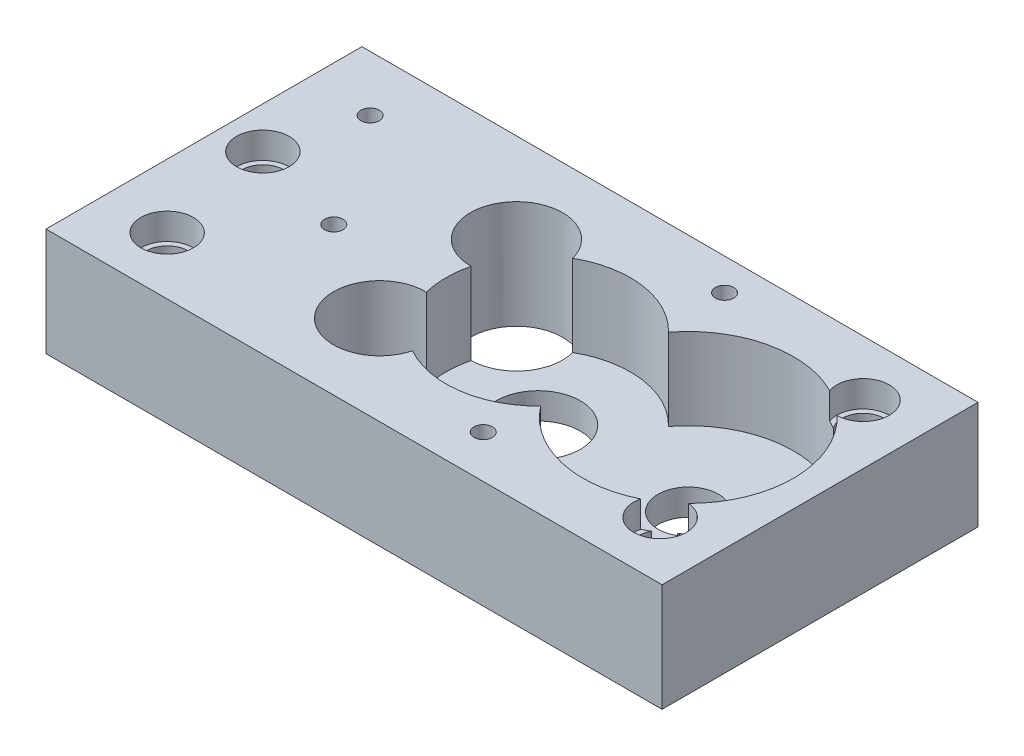
ISO-10303-21;
HEADER;
FILE_DESCRIPTION(('STEP AP214'),'2;1');
FILE_NAME('part.step','',(''),(''),'','','');
FILE_SCHEMA(('AUTOMOTIVE_DESIGN { 1 0 10303 214 1 1 1 1 }'));
ENDSEC;
DATA;
#1=APPLICATION_CONTEXT('core data for automotive mechanical design processes');
#2=APPLICATION_PROTOCOL_DEFINITION('international standard','automotive_design',2000,#1);
#3=PRODUCT_CONTEXT('',#1,'mechanical');
#4=PRODUCT('Part','Part','',(#3));
#5=PRODUCT_RELATED_PRODUCT_CATEGORY('part','',(#4));
#6=PRODUCT_DEFINITION_FORMATION('','',#4);
#7=PRODUCT_DEFINITION_CONTEXT('part definition',#1,'design');
#8=PRODUCT_DEFINITION('design','',#6,#7);
#9=PRODUCT_DEFINITION_SHAPE('','',#8);
#10=(LENGTH_UNIT() NAMED_UNIT(*) SI_UNIT(.MILLI.,.METRE.));
#11=(NAMED_UNIT(*) PLANE_ANGLE_UNIT() SI_UNIT($,.RADIAN.));
#12=(NAMED_UNIT(*) SI_UNIT($,.STERADIAN.) SOLID_ANGLE_UNIT());
#13=UNCERTAINTY_MEASURE_WITH_UNIT(LENGTH_MEASURE(1.E-05),#10,'distance_accuracy_value','');
#14=(GEOMETRIC_REPRESENTATION_CONTEXT(3) GLOBAL_UNCERTAINTY_ASSIGNED_CONTEXT((#13)) GLOBAL_UNIT_ASSIGNED_CONTEXT((#10,
#11,#12)) REPRESENTATION_CONTEXT('',''));
#15=CARTESIAN_POINT('',(0.,0.,0.));
#16=DIRECTION('',(0.,0.,1.));
#17=DIRECTION('',(1.,0.,0.));
#18=AXIS2_PLACEMENT_3D('',#15,#16,#17);
#19=CARTESIAN_POINT('',(18.3957400587213,4.1,6.));
#20=DIRECTION('',(0.,-1.,0.));
#21=DIRECTION('',(0.,0.,-1.));
#22=AXIS2_PLACEMENT_3D('',#19,#20,#21);
#23=CYLINDRICAL_SURFACE('',#22,4.);
#24=DIRECTION('',(0.,1.,0.));
#25=VECTOR('',#24,1.);
#26=CARTESIAN_POINT('',(20.8787211712977,2.05,2.8639507665554));
#27=LINE('',#26,#25);
#28=CARTESIAN_POINT('',(20.8787211712977,1.,2.8639507665554));
#29=VERTEX_POINT('',#28);
#30=CARTESIAN_POINT('',(20.8787211712977,3.1,2.8639507665554));
#31=VERTEX_POINT('',#30);
#32=EDGE_CURVE('E202',#29,#31,#27,.T.);
#33=ORIENTED_EDGE('',*,*,#32,.F.);
#34=CARTESIAN_POINT('',(18.3957400587213,1.,6.));
#35=DIRECTION('',(0.,1.,0.));
#36=DIRECTION('',(0.,0.,1.));
#37=AXIS2_PLACEMENT_3D('',#34,#35,#36);
#38=CIRCLE('',#37,4.);
#39=CARTESIAN_POINT('',(21.0082696303386,1.,9.02897494829937));
#40=VERTEX_POINT('',#39);
#41=EDGE_CURVE('E443',#40,#29,#38,.T.);
#42=ORIENTED_EDGE('',*,*,#41,.F.);
#43=DIRECTION('',(0.,1.,0.));
#44=VECTOR('',#43,1.);
#45=CARTESIAN_POINT('',(21.0082696303386,2.05,9.02897494829937));
#46=LINE('',#45,#44);
#47=CARTESIAN_POINT('',(21.0082696303386,3.1,9.02897494829937));
#48=VERTEX_POINT('',#47);
#49=EDGE_CURVE('E736',#48,#40,#46,.F.);
#50=ORIENTED_EDGE('',*,*,#49,.F.);
#51=CARTESIAN_POINT('',(18.3957400587213,3.1,6.));
#52=DIRECTION('',(0.,1.,0.));
#53=DIRECTION('',(0.,0.,1.));
#54=AXIS2_PLACEMENT_3D('',#51,#52,#53);
#55=CIRCLE('',#54,4.);
#56=CARTESIAN_POINT('',(21.2311790088857,3.1,8.82139787337597));
#57=VERTEX_POINT('',#56);
#58=EDGE_CURVE('E535',#48,#57,#55,.T.);
#59=ORIENTED_EDGE('',*,*,#58,.T.);
#60=DIRECTION('',(0.,1.,0.));
#61=VECTOR('',#60,1.);
#62=CARTESIAN_POINT('',(21.2311790088857,3.6,8.82139787337597));
#63=LINE('',#62,#61);
#64=CARTESIAN_POINT('',(21.2311790088857,4.1,8.82139787337597));
#65=VERTEX_POINT('',#64);
#66=EDGE_CURVE('E333',#65,#57,#63,.F.);
#67=ORIENTED_EDGE('',*,*,#66,.F.);
#68=CARTESIAN_POINT('',(18.3957400587213,4.1,6.));
#69=DIRECTION('',(0.,1.,0.));
#70=DIRECTION('',(0.,0.,1.));
#71=AXIS2_PLACEMENT_3D('',#68,#69,#70);
#72=CIRCLE('',#71,4.);
#73=CARTESIAN_POINT('',(21.1599528823134,4.1,3.10878443109328));
#74=VERTEX_POINT('',#73);
#75=EDGE_CURVE('E437',#65,#74,#72,.T.);
#76=ORIENTED_EDGE('',*,*,#75,.T.);
#77=DIRECTION('',(0.,1.,0.));
#78=VECTOR('',#77,1.);
#79=CARTESIAN_POINT('',(21.1599528823134,3.6,3.10878443109328));
#80=LINE('',#79,#78);
#81=CARTESIAN_POINT('',(21.1599528823134,3.1,3.10878443109328));
#82=VERTEX_POINT('',#81);
#83=EDGE_CURVE('E310',#82,#74,#80,.T.);
#84=ORIENTED_EDGE('',*,*,#83,.F.);
#85=CARTESIAN_POINT('',(18.3957400587213,3.1,6.));
#86=DIRECTION('',(0.,1.,0.));
#87=DIRECTION('',(0.,0.,1.));
#88=AXIS2_PLACEMENT_3D('',#85,#86,#87);
#89=CIRCLE('',#88,4.);
#90=EDGE_CURVE('E327',#82,#31,#89,.T.);
#91=ORIENTED_EDGE('',*,*,#90,.T.);
#92=EDGE_LOOP('',(#33,#42,#50,#59,#67,#76,#84,#91));
#93=FACE_BOUND('',#92,.T.);
#94=ADVANCED_FACE('F179',(#93),#23,.F.);
#95=DIRECTION('',(0.,1.,0.));
#96=VECTOR('',#95,1.);
#97=CARTESIAN_POINT('',(20.4382906192211,2.05,9.43918409042053));
#98=LINE('',#97,#96);
#99=CARTESIAN_POINT('',(20.4382906192211,1.,9.43918409042053));
#100=VERTEX_POINT('',#99);
#101=CARTESIAN_POINT('',(20.4382906192211,3.1,9.43918409042053));
#102=VERTEX_POINT('',#101);
#103=EDGE_CURVE('E194',#100,#102,#98,.T.);
#104=ORIENTED_EDGE('',*,*,#103,.F.);
#105=CARTESIAN_POINT('',(15.2167926903002,1.,8.42781663821815));
#106=VERTEX_POINT('',#105);
#107=EDGE_CURVE('E439',#106,#100,#38,.T.);
#108=ORIENTED_EDGE('',*,*,#107,.F.);
#109=DIRECTION('',(0.,-1.,0.));
#110=VECTOR('',#109,1.);
#111=CARTESIAN_POINT('',(15.2167926903002,2.55,8.42781663821815));
#112=LINE('',#111,#110);
#113=CARTESIAN_POINT('',(15.2167926903002,4.1,8.42781663821815));
#114=VERTEX_POINT('',#113);
#115=EDGE_CURVE('E467',#106,#114,#112,.F.);
#116=ORIENTED_EDGE('',*,*,#115,.T.);
#117=CARTESIAN_POINT('',(20.1706708298025,4.1,9.58463676791234));
#118=VERTEX_POINT('',#117);
#119=EDGE_CURVE('E432',#114,#118,#72,.T.);
#120=ORIENTED_EDGE('',*,*,#119,.T.);
#121=DIRECTION('',(0.,1.,0.));
#122=VECTOR('',#121,1.);
#123=CARTESIAN_POINT('',(20.1706708298025,3.6,9.58463676791234));
#124=LINE('',#123,#122);
#125=CARTESIAN_POINT('',(20.1706708298025,3.1,9.58463676791234));
#126=VERTEX_POINT('',#125);
#127=EDGE_CURVE('E328',#126,#118,#124,.T.);
#128=ORIENTED_EDGE('',*,*,#127,.F.);
#129=EDGE_CURVE('E536',#126,#102,#55,.T.);
#130=ORIENTED_EDGE('',*,*,#129,.T.);
#131=EDGE_LOOP('',(#104,#108,#116,#120,#128,#130));
#132=FACE_BOUND('',#131,.T.);
#133=ADVANCED_FACE('F588',(#132),#23,.F.);
#134=CARTESIAN_POINT('',(0.,1.,0.));
#135=DIRECTION('',(0.,1.,0.));
#136=DIRECTION('',(0.,0.,1.));
#137=AXIS2_PLACEMENT_3D('',#134,#135,#136);
#138=PLANE('',#137);
#139=CARTESIAN_POINT('',(21.1431759936535,1.,2.10892517299398));
#140=DIRECTION('',(0.,1.,0.));
#141=DIRECTION('',(0.,0.,1.));
#142=AXIS2_PLACEMENT_3D('',#139,#140,#141);
#143=CIRCLE('',#142,0.799999999999999);
#144=CARTESIAN_POINT('',(20.5201650145513,1.,2.61077905602974));
#145=VERTEX_POINT('',#144);
#146=EDGE_CURVE('E733',#145,#29,#143,.T.);
#147=ORIENTED_EDGE('',*,*,#146,.F.);
#148=CARTESIAN_POINT('',(15.2167926903002,1.,3.57218336178185));
#149=VERTEX_POINT('',#148);
#150=EDGE_CURVE('E318',#145,#149,#38,.T.);
#151=ORIENTED_EDGE('',*,*,#150,.T.);
#152=CARTESIAN_POINT('',(12.6957400587213,1.,6.));
#153=DIRECTION('',(0.,1.,0.));
#154=DIRECTION('',(0.,0.,1.));
#155=AXIS2_PLACEMENT_3D('',#152,#153,#154);
#156=CIRCLE('',#155,3.5);
#157=CARTESIAN_POINT('',(10.9641815468146,1.,2.95833842779254));
#158=VERTEX_POINT('',#157);
#159=EDGE_CURVE('E410',#149,#158,#156,.T.);
#160=ORIENTED_EDGE('',*,*,#159,.T.);
#161=CARTESIAN_POINT('',(9.27083130081252,1.,3.4));
#162=DIRECTION('',(0.,1.,0.));
#163=DIRECTION('',(0.,0.,1.));
#164=AXIS2_PLACEMENT_3D('',#161,#162,#163);
#165=CIRCLE('',#164,1.75);
#166=CARTESIAN_POINT('',(9.30058617760365,1.,5.14974702380291));
#167=VERTEX_POINT('',#166);
#168=EDGE_CURVE('E499',#167,#158,#165,.T.);
#169=ORIENTED_EDGE('',*,*,#168,.F.);
#170=CARTESIAN_POINT('',(9.30058617760365,1.,6.85025297619709));
#171=VERTEX_POINT('',#170);
#172=EDGE_CURVE('E415',#167,#171,#156,.T.);
#173=ORIENTED_EDGE('',*,*,#172,.T.);
#174=CARTESIAN_POINT('',(9.27083130081252,1.,8.6));
#175=DIRECTION('',(0.,1.,0.));
#176=DIRECTION('',(0.,0.,1.));
#177=AXIS2_PLACEMENT_3D('',#174,#175,#176);
#178=CIRCLE('',#177,1.75);
#179=CARTESIAN_POINT('',(10.9641815468146,1.,9.04166157220745));
#180=VERTEX_POINT('',#179);
#181=EDGE_CURVE('E475',#180,#171,#178,.T.);
#182=ORIENTED_EDGE('',*,*,#181,.F.);
#183=EDGE_CURVE('E382',#180,#106,#156,.T.);
#184=ORIENTED_EDGE('',*,*,#183,.T.);
#185=ORIENTED_EDGE('',*,*,#107,.T.);
#186=CARTESIAN_POINT('',(21.1431759936535,1.,9.81751808163903));
#187=DIRECTION('',(0.,1.,0.));
#188=DIRECTION('',(0.,0.,1.));
#189=AXIS2_PLACEMENT_3D('',#186,#187,#188);
#190=CIRCLE('',#189,0.799999999999999);
#191=EDGE_CURVE('E741',#40,#100,#190,.T.);
#192=ORIENTED_EDGE('',*,*,#191,.F.);
#193=ORIENTED_EDGE('',*,*,#41,.T.);
#194=EDGE_LOOP('',(#147,#151,#160,#169,#173,#182,#184,#185,#192,#193));
#195=FACE_BOUND('',#194,.T.);
#196=CARTESIAN_POINT('',(12.6957400587213,1.,6.));
#197=DIRECTION('',(0.,1.,0.));
#198=DIRECTION('',(0.,0.,1.));
#199=AXIS2_PLACEMENT_3D('',#196,#197,#198);
#200=CIRCLE('',#199,1.6);
#201=CARTESIAN_POINT('',(12.6957400587213,1.,7.6));
#202=VERTEX_POINT('',#201);
#203=EDGE_CURVE('E491',#202,#202,#200,.T.);
#204=ORIENTED_EDGE('',*,*,#203,.F.);
#205=EDGE_LOOP('',(#204));
#206=FACE_BOUND('',#205,.T.);
#207=CARTESIAN_POINT('',(18.3957400587213,1.,6.));
#208=DIRECTION('',(0.,1.,0.));
#209=DIRECTION('',(0.,0.,1.));
#210=AXIS2_PLACEMENT_3D('',#207,#208,#209);
#211=CIRCLE('',#210,1.15);
#212=CARTESIAN_POINT('',(18.3957400587213,1.,7.15));
#213=VERTEX_POINT('',#212);
#214=EDGE_CURVE('E483',#213,#213,#211,.T.);
#215=ORIENTED_EDGE('',*,*,#214,.F.);
#216=EDGE_LOOP('',(#215));
#217=FACE_BOUND('',#216,.T.);
#218=ADVANCED_FACE('F591',(#195,#206,#217),#138,.T.);
#219=CARTESIAN_POINT('',(0.,0.,0.));
#220=DIRECTION('',(0.,1.,0.));
#221=DIRECTION('',(0.,0.,1.));
#222=AXIS2_PLACEMENT_3D('',#219,#220,#221);
#223=PLANE('',#222);
#224=CARTESIAN_POINT('',(21.1431759936535,0.,2.10892517299398));
#225=DIRECTION('',(0.,1.,0.));
#226=DIRECTION('',(0.,0.,1.));
#227=AXIS2_PLACEMENT_3D('',#224,#225,#226);
#228=CIRCLE('',#227,0.799999999999999);
#229=CARTESIAN_POINT('',(21.1431759936535,0.,2.90892517299398));
#230=VERTEX_POINT('',#229);
#231=EDGE_CURVE('E725',#230,#230,#228,.T.);
#232=ORIENTED_EDGE('',*,*,#231,.T.);
#233=EDGE_LOOP('',(#232));
#234=FACE_BOUND('',#233,.T.);
#235=CARTESIAN_POINT('',(21.1431759936535,0.,9.81751808163903));
#236=DIRECTION('',(0.,1.,0.));
#237=DIRECTION('',(0.,0.,1.));
#238=AXIS2_PLACEMENT_3D('',#235,#236,#237);
#239=CIRCLE('',#238,0.799999999999999);
#240=CARTESIAN_POINT('',(21.1431759936535,0.,10.617518081639));
#241=VERTEX_POINT('',#240);
#242=EDGE_CURVE('E718',#241,#241,#239,.T.);
#243=ORIENTED_EDGE('',*,*,#242,.T.);
#244=EDGE_LOOP('',(#243));
#245=FACE_BOUND('',#244,.T.);
#246=CARTESIAN_POINT('',(2.41918552162618,0.,9.81751808163903));
#247=DIRECTION('',(0.,1.,0.));
#248=DIRECTION('',(0.,0.,1.));
#249=AXIS2_PLACEMENT_3D('',#246,#247,#248);
#250=CIRCLE('',#249,0.8);
#251=CARTESIAN_POINT('',(2.41918552162618,0.,10.617518081639));
#252=VERTEX_POINT('',#251);
#253=EDGE_CURVE('E715',#252,#252,#250,.T.);
#254=ORIENTED_EDGE('',*,*,#253,.T.);
#255=EDGE_LOOP('',(#254));
#256=FACE_BOUND('',#255,.T.);
#257=CARTESIAN_POINT('',(1.5689431846177,0.,5.33248975391931));
#258=DIRECTION('',(0.,1.,0.));
#259=DIRECTION('',(0.,0.,1.));
#260=AXIS2_PLACEMENT_3D('',#257,#258,#259);
#261=CIRCLE('',#260,0.8);
#262=CARTESIAN_POINT('',(1.5689431846177,0.,6.13248975391931));
#263=VERTEX_POINT('',#262);
#264=EDGE_CURVE('E345',#263,#263,#261,.T.);
#265=ORIENTED_EDGE('',*,*,#264,.T.);
#266=EDGE_LOOP('',(#265));
#267=FACE_BOUND('',#266,.T.);
#268=DIRECTION('',(0.,0.,1.));
#269=VECTOR('',#268,1.);
#270=CARTESIAN_POINT('',(0.,0.,0.));
#271=LINE('',#270,#269);
#272=CARTESIAN_POINT('',(0.,0.,0.));
#273=VERTEX_POINT('',#272);
#274=CARTESIAN_POINT('',(0.,0.,12.));
#275=VERTEX_POINT('',#274);
#276=EDGE_CURVE('E503',#273,#275,#271,.T.);
#277=ORIENTED_EDGE('',*,*,#276,.F.);
#278=DIRECTION('',(1.,0.,0.));
#279=VECTOR('',#278,1.);
#280=CARTESIAN_POINT('',(0.,0.,0.));
#281=LINE('',#280,#279);
#282=CARTESIAN_POINT('',(23.4,0.,0.));
#283=VERTEX_POINT('',#282);
#284=EDGE_CURVE('E518',#273,#283,#281,.T.);
#285=ORIENTED_EDGE('',*,*,#284,.T.);
#286=DIRECTION('',(0.,0.,1.));
#287=VECTOR('',#286,1.);
#288=CARTESIAN_POINT('',(23.4,0.,0.));
#289=LINE('',#288,#287);
#290=CARTESIAN_POINT('',(23.4,0.,12.));
#291=VERTEX_POINT('',#290);
#292=EDGE_CURVE('E514',#283,#291,#289,.T.);
#293=ORIENTED_EDGE('',*,*,#292,.T.);
#294=DIRECTION('',(1.,0.,0.));
#295=VECTOR('',#294,1.);
#296=CARTESIAN_POINT('',(0.,0.,12.));
#297=LINE('',#296,#295);
#298=EDGE_CURVE('E510',#275,#291,#297,.T.);
#299=ORIENTED_EDGE('',*,*,#298,.F.);
#300=EDGE_LOOP('',(#277,#285,#293,#299));
#301=FACE_BOUND('',#300,.T.);
#302=CARTESIAN_POINT('',(9.27083130081252,0.,3.4));
#303=DIRECTION('',(0.,1.,0.));
#304=DIRECTION('',(0.,0.,1.));
#305=AXIS2_PLACEMENT_3D('',#302,#303,#304);
#306=CIRCLE('',#305,1.75);
#307=CARTESIAN_POINT('',(9.27083130081252,0.,5.15));
#308=VERTEX_POINT('',#307);
#309=EDGE_CURVE('E495',#308,#308,#306,.T.);
#310=ORIENTED_EDGE('',*,*,#309,.T.);
#311=EDGE_LOOP('',(#310));
#312=FACE_BOUND('',#311,.T.);
#313=CARTESIAN_POINT('',(12.6957400587213,0.,6.));
#314=DIRECTION('',(0.,1.,0.));
#315=DIRECTION('',(0.,0.,1.));
#316=AXIS2_PLACEMENT_3D('',#313,#314,#315);
#317=CIRCLE('',#316,1.6);
#318=CARTESIAN_POINT('',(12.6957400587213,0.,7.6));
#319=VERTEX_POINT('',#318);
#320=EDGE_CURVE('E487',#319,#319,#317,.T.);
#321=ORIENTED_EDGE('',*,*,#320,.T.);
#322=EDGE_LOOP('',(#321));
#323=FACE_BOUND('',#322,.T.);
#324=CARTESIAN_POINT('',(18.3957400587213,0.,6.));
#325=DIRECTION('',(0.,1.,0.));
#326=DIRECTION('',(0.,0.,1.));
#327=AXIS2_PLACEMENT_3D('',#324,#325,#326);
#328=CIRCLE('',#327,1.15);
#329=CARTESIAN_POINT('',(18.3957400587213,0.,7.15));
#330=VERTEX_POINT('',#329);
#331=EDGE_CURVE('E479',#330,#330,#328,.T.);
#332=ORIENTED_EDGE('',*,*,#331,.T.);
#333=EDGE_LOOP('',(#332));
#334=FACE_BOUND('',#333,.T.);
#335=CARTESIAN_POINT('',(9.27083130081252,0.,8.6));
#336=DIRECTION('',(0.,1.,0.));
#337=DIRECTION('',(0.,0.,1.));
#338=AXIS2_PLACEMENT_3D('',#335,#336,#337);
#339=CIRCLE('',#338,1.75);
#340=CARTESIAN_POINT('',(9.27083130081252,0.,10.35));
#341=VERTEX_POINT('',#340);
#342=EDGE_CURVE('E474',#341,#341,#339,.T.);
#343=ORIENTED_EDGE('',*,*,#342,.T.);
#344=EDGE_LOOP('',(#343));
#345=FACE_BOUND('',#344,.T.);
#346=ADVANCED_FACE('F605',(#234,#245,#256,#267,#301,#312,#323,#334,#345),#223,.F.);
#347=CARTESIAN_POINT('',(0.,1.,0.));
#348=DIRECTION('',(1.,0.,0.));
#349=DIRECTION('',(0.,0.,-1.));
#350=AXIS2_PLACEMENT_3D('',#347,#348,#349);
#351=PLANE('',#350);
#352=ORIENTED_EDGE('',*,*,#276,.T.);
#353=DIRECTION('',(0.,-1.,0.));
#354=VECTOR('',#353,1.);
#355=CARTESIAN_POINT('',(0.,1.,12.));
#356=LINE('',#355,#354);
#357=CARTESIAN_POINT('',(0.,4.1,12.));
#358=VERTEX_POINT('',#357);
#359=EDGE_CURVE('E531',#358,#275,#356,.T.);
#360=ORIENTED_EDGE('',*,*,#359,.F.);
#361=DIRECTION('',(0.,0.,-1.));
#362=VECTOR('',#361,1.);
#363=CARTESIAN_POINT('',(0.,4.1,0.));
#364=LINE('',#363,#362);
#365=CARTESIAN_POINT('',(0.,4.1,0.));
#366=VERTEX_POINT('',#365);
#367=EDGE_CURVE('E459',#358,#366,#364,.T.);
#368=ORIENTED_EDGE('',*,*,#367,.T.);
#369=DIRECTION('',(0.,-1.,0.));
#370=VECTOR('',#369,1.);
#371=CARTESIAN_POINT('',(0.,1.,0.));
#372=LINE('',#371,#370);
#373=EDGE_CURVE('E522',#366,#273,#372,.T.);
#374=ORIENTED_EDGE('',*,*,#373,.T.);
#375=EDGE_LOOP('',(#352,#360,#368,#374));
#376=FACE_BOUND('',#375,.T.);
#377=ADVANCED_FACE('F181',(#376),#351,.F.);
#378=CARTESIAN_POINT('',(0.,1.,12.));
#379=DIRECTION('',(0.,0.,-1.));
#380=DIRECTION('',(-1.,0.,0.));
#381=AXIS2_PLACEMENT_3D('',#378,#379,#380);
#382=PLANE('',#381);
#383=ORIENTED_EDGE('',*,*,#298,.T.);
#384=DIRECTION('',(0.,-1.,0.));
#385=VECTOR('',#384,1.);
#386=CARTESIAN_POINT('',(23.4,1.,12.));
#387=LINE('',#386,#385);
#388=CARTESIAN_POINT('',(23.4,4.1,12.));
#389=VERTEX_POINT('',#388);
#390=EDGE_CURVE('E528',#389,#291,#387,.T.);
#391=ORIENTED_EDGE('',*,*,#390,.F.);
#392=DIRECTION('',(-1.,0.,0.));
#393=VECTOR('',#392,1.);
#394=CARTESIAN_POINT('',(0.,4.1,12.));
#395=LINE('',#394,#393);
#396=EDGE_CURVE('E463',#389,#358,#395,.T.);
#397=ORIENTED_EDGE('',*,*,#396,.T.);
#398=ORIENTED_EDGE('',*,*,#359,.T.);
#399=EDGE_LOOP('',(#383,#391,#397,#398));
#400=FACE_BOUND('',#399,.T.);
#401=ADVANCED_FACE('F778',(#400),#382,.F.);
#402=CARTESIAN_POINT('',(23.4,1.,0.));
#403=DIRECTION('',(1.,0.,0.));
#404=DIRECTION('',(0.,0.,-1.));
#405=AXIS2_PLACEMENT_3D('',#402,#403,#404);
#406=PLANE('',#405);
#407=ORIENTED_EDGE('',*,*,#292,.F.);
#408=DIRECTION('',(0.,-1.,0.));
#409=VECTOR('',#408,1.);
#410=CARTESIAN_POINT('',(23.4,1.,0.));
#411=LINE('',#410,#409);
#412=CARTESIAN_POINT('',(23.4,4.1,0.));
#413=VERTEX_POINT('',#412);
#414=EDGE_CURVE('E525',#413,#283,#411,.T.);
#415=ORIENTED_EDGE('',*,*,#414,.F.);
#416=DIRECTION('',(0.,0.,-1.));
#417=VECTOR('',#416,1.);
#418=CARTESIAN_POINT('',(23.4,4.1,0.));
#419=LINE('',#418,#417);
#420=EDGE_CURVE('E451',#389,#413,#419,.T.);
#421=ORIENTED_EDGE('',*,*,#420,.F.);
#422=ORIENTED_EDGE('',*,*,#390,.T.);
#423=EDGE_LOOP('',(#407,#415,#421,#422));
#424=FACE_BOUND('',#423,.T.);
#425=ADVANCED_FACE('F775',(#424),#406,.T.);
#426=CARTESIAN_POINT('',(0.,1.,0.));
#427=DIRECTION('',(0.,0.,-1.));
#428=DIRECTION('',(-1.,0.,0.));
#429=AXIS2_PLACEMENT_3D('',#426,#427,#428);
#430=PLANE('',#429);
#431=ORIENTED_EDGE('',*,*,#284,.F.);
#432=ORIENTED_EDGE('',*,*,#373,.F.);
#433=DIRECTION('',(-1.,0.,0.));
#434=VECTOR('',#433,1.);
#435=CARTESIAN_POINT('',(0.,4.1,0.));
#436=LINE('',#435,#434);
#437=EDGE_CURVE('E455',#413,#366,#436,.T.);
#438=ORIENTED_EDGE('',*,*,#437,.F.);
#439=ORIENTED_EDGE('',*,*,#414,.T.);
#440=EDGE_LOOP('',(#431,#432,#438,#439));
#441=FACE_BOUND('',#440,.T.);
#442=ADVANCED_FACE('F601',(#441),#430,.T.);
#443=CARTESIAN_POINT('',(9.27083130081252,1.,3.4));
#444=DIRECTION('',(0.,-1.,0.));
#445=DIRECTION('',(0.,0.,-1.));
#446=AXIS2_PLACEMENT_3D('',#443,#444,#445);
#447=CYLINDRICAL_SURFACE('',#446,1.75);
#448=ORIENTED_EDGE('',*,*,#168,.T.);
#449=DIRECTION('',(0.,-1.,0.));
#450=VECTOR('',#449,1.);
#451=CARTESIAN_POINT('',(10.9641815468146,2.55,2.95833842779254));
#452=LINE('',#451,#450);
#453=CARTESIAN_POINT('',(10.9641815468146,4.1,2.95833842779254));
#454=VERTEX_POINT('',#453);
#455=EDGE_CURVE('E416',#158,#454,#452,.F.);
#456=ORIENTED_EDGE('',*,*,#455,.T.);
#457=CARTESIAN_POINT('',(9.27083130081252,4.1,3.4));
#458=DIRECTION('',(0.,1.,0.));
#459=DIRECTION('',(0.,0.,1.));
#460=AXIS2_PLACEMENT_3D('',#457,#458,#459);
#461=CIRCLE('',#460,1.75);
#462=CARTESIAN_POINT('',(9.30058617760365,4.1,5.14974702380291));
#463=VERTEX_POINT('',#462);
#464=EDGE_CURVE('E436',#454,#463,#461,.T.);
#465=ORIENTED_EDGE('',*,*,#464,.T.);
#466=DIRECTION('',(0.,-1.,0.));
#467=VECTOR('',#466,1.);
#468=CARTESIAN_POINT('',(9.30058617760365,2.55,5.14974702380291));
#469=LINE('',#468,#467);
#470=EDGE_CURVE('E420',#463,#167,#469,.T.);
#471=ORIENTED_EDGE('',*,*,#470,.T.);
#472=EDGE_LOOP('',(#448,#456,#465,#471));
#473=FACE_BOUND('',#472,.T.);
#474=ORIENTED_EDGE('',*,*,#309,.F.);
#475=EDGE_LOOP('',(#474));
#476=FACE_BOUND('',#475,.T.);
#477=ADVANCED_FACE('F597',(#473,#476),#447,.F.);
#478=CARTESIAN_POINT('',(12.6957400587213,1.,6.));
#479=DIRECTION('',(0.,-1.,0.));
#480=DIRECTION('',(0.,0.,-1.));
#481=AXIS2_PLACEMENT_3D('',#478,#479,#480);
#482=CYLINDRICAL_SURFACE('',#481,1.6);
#483=ORIENTED_EDGE('',*,*,#203,.T.);
#484=EDGE_LOOP('',(#483));
#485=FACE_BOUND('',#484,.T.);
#486=ORIENTED_EDGE('',*,*,#320,.F.);
#487=EDGE_LOOP('',(#486));
#488=FACE_BOUND('',#487,.T.);
#489=ADVANCED_FACE('F600',(#485,#488),#482,.F.);
#490=CARTESIAN_POINT('',(18.3957400587213,1.,6.));
#491=DIRECTION('',(0.,-1.,0.));
#492=DIRECTION('',(0.,0.,-1.));
#493=AXIS2_PLACEMENT_3D('',#490,#491,#492);
#494=CYLINDRICAL_SURFACE('',#493,1.15);
#495=ORIENTED_EDGE('',*,*,#214,.T.);
#496=EDGE_LOOP('',(#495));
#497=FACE_BOUND('',#496,.T.);
#498=ORIENTED_EDGE('',*,*,#331,.F.);
#499=EDGE_LOOP('',(#498));
#500=FACE_BOUND('',#499,.T.);
#501=ADVANCED_FACE('F616',(#497,#500),#494,.F.);
#502=CARTESIAN_POINT('',(9.27083130081252,1.,8.6));
#503=DIRECTION('',(0.,-1.,0.));
#504=DIRECTION('',(0.,0.,-1.));
#505=AXIS2_PLACEMENT_3D('',#502,#503,#504);
#506=CYLINDRICAL_SURFACE('',#505,1.75);
#507=ORIENTED_EDGE('',*,*,#181,.T.);
#508=DIRECTION('',(0.,-1.,0.));
#509=VECTOR('',#508,1.);
#510=CARTESIAN_POINT('',(9.30058617760365,2.55,6.85025297619709));
#511=LINE('',#510,#509);
#512=CARTESIAN_POINT('',(9.30058617760365,4.1,6.85025297619709));
#513=VERTEX_POINT('',#512);
#514=EDGE_CURVE('E424',#171,#513,#511,.F.);
#515=ORIENTED_EDGE('',*,*,#514,.T.);
#516=CARTESIAN_POINT('',(9.27083130081252,4.1,8.6));
#517=DIRECTION('',(0.,1.,0.));
#518=DIRECTION('',(0.,0.,1.));
#519=AXIS2_PLACEMENT_3D('',#516,#517,#518);
#520=CIRCLE('',#519,1.75);
#521=CARTESIAN_POINT('',(10.9641815468146,4.1,9.04166157220745));
#522=VERTEX_POINT('',#521);
#523=EDGE_CURVE('E447',#513,#522,#520,.T.);
#524=ORIENTED_EDGE('',*,*,#523,.T.);
#525=DIRECTION('',(0.,-1.,0.));
#526=VECTOR('',#525,1.);
#527=CARTESIAN_POINT('',(10.9641815468146,2.55,9.04166157220746));
#528=LINE('',#527,#526);
#529=EDGE_CURVE('E428',#522,#180,#528,.T.);
#530=ORIENTED_EDGE('',*,*,#529,.T.);
#531=EDGE_LOOP('',(#507,#515,#524,#530));
#532=FACE_BOUND('',#531,.T.);
#533=ORIENTED_EDGE('',*,*,#342,.F.);
#534=EDGE_LOOP('',(#533));
#535=FACE_BOUND('',#534,.T.);
#536=ADVANCED_FACE('F580',(#532,#535),#506,.F.);
#537=CARTESIAN_POINT('',(0.,4.1,0.));
#538=DIRECTION('',(0.,1.,0.));
#539=DIRECTION('',(0.,0.,1.));
#540=AXIS2_PLACEMENT_3D('',#537,#538,#539);
#541=PLANE('',#540);
#542=CARTESIAN_POINT('',(21.1431759936535,4.1,2.10892517299398));
#543=DIRECTION('',(0.,1.,0.));
#544=DIRECTION('',(0.,0.,1.));
#545=AXIS2_PLACEMENT_3D('',#542,#543,#544);
#546=CIRCLE('',#545,1.);
#547=CARTESIAN_POINT('',(20.1953402535323,4.1,2.42768434501707));
#548=VERTEX_POINT('',#547);
#549=EDGE_CURVE('E562',#74,#548,#546,.T.);
#550=ORIENTED_EDGE('',*,*,#549,.F.);
#551=ORIENTED_EDGE('',*,*,#75,.F.);
#552=CARTESIAN_POINT('',(21.1431759936535,4.1,9.81751808163903));
#553=DIRECTION('',(0.,1.,0.));
#554=DIRECTION('',(0.,0.,1.));
#555=AXIS2_PLACEMENT_3D('',#552,#553,#554);
#556=CIRCLE('',#555,1.);
#557=EDGE_CURVE('E549',#118,#65,#556,.T.);
#558=ORIENTED_EDGE('',*,*,#557,.F.);
#559=ORIENTED_EDGE('',*,*,#119,.F.);
#560=CARTESIAN_POINT('',(12.6957400587213,4.1,6.));
#561=DIRECTION('',(0.,1.,0.));
#562=DIRECTION('',(0.,0.,1.));
#563=AXIS2_PLACEMENT_3D('',#560,#561,#562);
#564=CIRCLE('',#563,3.5);
#565=EDGE_CURVE('E406',#522,#114,#564,.T.);
#566=ORIENTED_EDGE('',*,*,#565,.F.);
#567=ORIENTED_EDGE('',*,*,#523,.F.);
#568=EDGE_CURVE('E409',#463,#513,#564,.T.);
#569=ORIENTED_EDGE('',*,*,#568,.F.);
#570=ORIENTED_EDGE('',*,*,#464,.F.);
#571=CARTESIAN_POINT('',(15.2167926903002,4.1,3.57218336178185));
#572=VERTEX_POINT('',#571);
#573=EDGE_CURVE('E411',#572,#454,#564,.T.);
#574=ORIENTED_EDGE('',*,*,#573,.F.);
#575=EDGE_CURVE('E438',#548,#572,#72,.T.);
#576=ORIENTED_EDGE('',*,*,#575,.F.);
#577=EDGE_LOOP('',(#550,#551,#558,#559,#566,#567,#569,#570,#574,#576));
#578=FACE_BOUND('',#577,.T.);
#579=CARTESIAN_POINT('',(2.41918552162618,4.1,9.81751808163903));
#580=DIRECTION('',(0.,1.,0.));
#581=DIRECTION('',(0.,0.,1.));
#582=AXIS2_PLACEMENT_3D('',#579,#580,#581);
#583=CIRCLE('',#582,1.);
#584=CARTESIAN_POINT('',(2.41918552162618,4.1,10.817518081639));
#585=VERTEX_POINT('',#584);
#586=EDGE_CURVE('E373',#585,#585,#583,.T.);
#587=ORIENTED_EDGE('',*,*,#586,.F.);
#588=EDGE_LOOP('',(#587));
#589=FACE_BOUND('',#588,.T.);
#590=CARTESIAN_POINT('',(1.5689431846177,4.1,5.33248975391931));
#591=DIRECTION('',(0.,1.,0.));
#592=DIRECTION('',(0.,0.,1.));
#593=AXIS2_PLACEMENT_3D('',#590,#591,#592);
#594=CIRCLE('',#593,1.);
#595=CARTESIAN_POINT('',(1.5689431846177,4.1,6.33248975391931));
#596=VERTEX_POINT('',#595);
#597=EDGE_CURVE('E365',#596,#596,#594,.T.);
#598=ORIENTED_EDGE('',*,*,#597,.F.);
#599=EDGE_LOOP('',(#598));
#600=FACE_BOUND('',#599,.T.);
#601=CARTESIAN_POINT('',(2.41918552162618,4.1,2.10892517299398));
#602=DIRECTION('',(0.,1.,0.));
#603=DIRECTION('',(0.,0.,1.));
#604=AXIS2_PLACEMENT_3D('',#601,#602,#603);
#605=CIRCLE('',#604,0.35);
#606=CARTESIAN_POINT('',(2.41918552162618,4.1,2.45892517299398));
#607=VERTEX_POINT('',#606);
#608=EDGE_CURVE('E383',#607,#607,#605,.T.);
#609=ORIENTED_EDGE('',*,*,#608,.F.);
#610=EDGE_LOOP('',(#609));
#611=FACE_BOUND('',#610,.T.);
#612=CARTESIAN_POINT('',(5.31468103660189,4.1,6.38438815309847));
#613=DIRECTION('',(0.,1.,0.));
#614=DIRECTION('',(0.,0.,1.));
#615=AXIS2_PLACEMENT_3D('',#612,#613,#614);
#616=CIRCLE('',#615,0.35);
#617=CARTESIAN_POINT('',(5.31468103660189,4.1,6.73438815309847));
#618=VERTEX_POINT('',#617);
#619=EDGE_CURVE('E387',#618,#618,#616,.T.);
#620=ORIENTED_EDGE('',*,*,#619,.F.);
#621=EDGE_LOOP('',(#620));
#622=FACE_BOUND('',#621,.T.);
#623=CARTESIAN_POINT('',(14.9835215030027,4.1,1.20993224600326));
#624=DIRECTION('',(0.,1.,0.));
#625=DIRECTION('',(0.,0.,1.));
#626=AXIS2_PLACEMENT_3D('',#623,#624,#625);
#627=CIRCLE('',#626,0.349999999999999);
#628=CARTESIAN_POINT('',(14.9835215030027,4.1,1.55993224600326));
#629=VERTEX_POINT('',#628);
#630=EDGE_CURVE('E395',#629,#629,#627,.T.);
#631=ORIENTED_EDGE('',*,*,#630,.F.);
#632=EDGE_LOOP('',(#631));
#633=FACE_BOUND('',#632,.T.);
#634=CARTESIAN_POINT('',(14.9835215030027,4.1,10.3761112814291));
#635=DIRECTION('',(0.,1.,0.));
#636=DIRECTION('',(0.,0.,1.));
#637=AXIS2_PLACEMENT_3D('',#634,#635,#636);
#638=CIRCLE('',#637,0.349999999999999);
#639=CARTESIAN_POINT('',(14.9835215030027,4.1,10.7261112814291));
#640=VERTEX_POINT('',#639);
#641=EDGE_CURVE('E370',#640,#640,#638,.T.);
#642=ORIENTED_EDGE('',*,*,#641,.F.);
#643=EDGE_LOOP('',(#642));
#644=FACE_BOUND('',#643,.T.);
#645=ORIENTED_EDGE('',*,*,#420,.T.);
#646=ORIENTED_EDGE('',*,*,#437,.T.);
#647=ORIENTED_EDGE('',*,*,#367,.F.);
#648=ORIENTED_EDGE('',*,*,#396,.F.);
#649=EDGE_LOOP('',(#645,#646,#647,#648));
#650=FACE_BOUND('',#649,.T.);
#651=ADVANCED_FACE('F558',(#578,#589,#600,#611,#622,#633,#644,#650),#541,.T.);
#652=DIRECTION('',(0.,1.,0.));
#653=VECTOR('',#652,1.);
#654=CARTESIAN_POINT('',(20.5201650145513,2.05,2.61077905602974));
#655=LINE('',#654,#653);
#656=CARTESIAN_POINT('',(20.5201650145513,3.1,2.61077905602974));
#657=VERTEX_POINT('',#656);
#658=EDGE_CURVE('E304',#657,#145,#655,.F.);
#659=ORIENTED_EDGE('',*,*,#658,.F.);
#660=CARTESIAN_POINT('',(20.1953402535323,3.1,2.42768434501707));
#661=VERTEX_POINT('',#660);
#662=EDGE_CURVE('E315',#657,#661,#89,.T.);
#663=ORIENTED_EDGE('',*,*,#662,.T.);
#664=DIRECTION('',(0.,1.,0.));
#665=VECTOR('',#664,1.);
#666=CARTESIAN_POINT('',(20.1953402535323,3.6,2.42768434501707));
#667=LINE('',#666,#665);
#668=EDGE_CURVE('E332',#548,#661,#667,.F.);
#669=ORIENTED_EDGE('',*,*,#668,.F.);
#670=ORIENTED_EDGE('',*,*,#575,.T.);
#671=DIRECTION('',(0.,-1.,0.));
#672=VECTOR('',#671,1.);
#673=CARTESIAN_POINT('',(15.2167926903002,2.55,3.57218336178185));
#674=LINE('',#673,#672);
#675=EDGE_CURVE('E471',#572,#149,#674,.T.);
#676=ORIENTED_EDGE('',*,*,#675,.T.);
#677=ORIENTED_EDGE('',*,*,#150,.F.);
#678=EDGE_LOOP('',(#659,#663,#669,#670,#676,#677));
#679=FACE_BOUND('',#678,.T.);
#680=ADVANCED_FACE('F313',(#679),#23,.F.);
#681=CARTESIAN_POINT('',(12.6957400587213,4.1,6.));
#682=DIRECTION('',(0.,-1.,0.));
#683=DIRECTION('',(0.,0.,-1.));
#684=AXIS2_PLACEMENT_3D('',#681,#682,#683);
#685=CYLINDRICAL_SURFACE('',#684,3.5);
#686=ORIENTED_EDGE('',*,*,#565,.T.);
#687=ORIENTED_EDGE('',*,*,#115,.F.);
#688=ORIENTED_EDGE('',*,*,#183,.F.);
#689=ORIENTED_EDGE('',*,*,#529,.F.);
#690=EDGE_LOOP('',(#686,#687,#688,#689));
#691=FACE_BOUND('',#690,.T.);
#692=ADVANCED_FACE('F585',(#691),#685,.F.);
#693=ORIENTED_EDGE('',*,*,#159,.F.);
#694=ORIENTED_EDGE('',*,*,#675,.F.);
#695=ORIENTED_EDGE('',*,*,#573,.T.);
#696=ORIENTED_EDGE('',*,*,#455,.F.);
#697=EDGE_LOOP('',(#693,#694,#695,#696));
#698=FACE_BOUND('',#697,.T.);
#699=ADVANCED_FACE('F569',(#698),#685,.F.);
#700=ORIENTED_EDGE('',*,*,#172,.F.);
#701=ORIENTED_EDGE('',*,*,#470,.F.);
#702=ORIENTED_EDGE('',*,*,#568,.T.);
#703=ORIENTED_EDGE('',*,*,#514,.F.);
#704=EDGE_LOOP('',(#700,#701,#702,#703));
#705=FACE_BOUND('',#704,.T.);
#706=ADVANCED_FACE('F576',(#705),#685,.F.);
#707=CARTESIAN_POINT('',(14.9835215030027,2.1,10.3761112814291));
#708=DIRECTION('',(0.,1.,0.));
#709=DIRECTION('',(0.,0.,1.));
#710=AXIS2_PLACEMENT_3D('',#707,#708,#709);
#711=CYLINDRICAL_SURFACE('',#710,0.349999999999999);
#712=CARTESIAN_POINT('',(14.9835215030027,2.1,10.3761112814291));
#713=DIRECTION('',(0.,1.,0.));
#714=DIRECTION('',(0.,0.,1.));
#715=AXIS2_PLACEMENT_3D('',#712,#713,#714);
#716=CIRCLE('',#715,0.349999999999999);
#717=CARTESIAN_POINT('',(14.9835215030027,2.1,10.7261112814291));
#718=VERTEX_POINT('',#717);
#719=EDGE_CURVE('E364',#718,#718,#716,.T.);
#720=ORIENTED_EDGE('',*,*,#719,.F.);
#721=EDGE_LOOP('',(#720));
#722=FACE_BOUND('',#721,.T.);
#723=ORIENTED_EDGE('',*,*,#641,.T.);
#724=EDGE_LOOP('',(#723));
#725=FACE_BOUND('',#724,.T.);
#726=ADVANCED_FACE('F640',(#722,#725),#711,.F.);
#727=CARTESIAN_POINT('',(14.9835215030027,2.1,10.3761112814291));
#728=DIRECTION('',(0.,1.,0.));
#729=DIRECTION('',(0.,0.,1.));
#730=AXIS2_PLACEMENT_3D('',#727,#728,#729);
#731=PLANE('',#730);
#732=ORIENTED_EDGE('',*,*,#719,.T.);
#733=EDGE_LOOP('',(#732));
#734=FACE_BOUND('',#733,.T.);
#735=ADVANCED_FACE('F644',(#734),#731,.T.);
#736=CARTESIAN_POINT('',(14.9835215030027,2.1,1.20993224600326));
#737=DIRECTION('',(0.,1.,0.));
#738=DIRECTION('',(0.,0.,1.));
#739=AXIS2_PLACEMENT_3D('',#736,#737,#738);
#740=CYLINDRICAL_SURFACE('',#739,0.349999999999999);
#741=CARTESIAN_POINT('',(14.9835215030027,2.1,1.20993224600326));
#742=DIRECTION('',(0.,1.,0.));
#743=DIRECTION('',(0.,0.,1.));
#744=AXIS2_PLACEMENT_3D('',#741,#742,#743);
#745=CIRCLE('',#744,0.349999999999999);
#746=CARTESIAN_POINT('',(14.9835215030027,2.1,1.55993224600326));
#747=VERTEX_POINT('',#746);
#748=EDGE_CURVE('E399',#747,#747,#745,.T.);
#749=ORIENTED_EDGE('',*,*,#748,.F.);
#750=EDGE_LOOP('',(#749));
#751=FACE_BOUND('',#750,.T.);
#752=ORIENTED_EDGE('',*,*,#630,.T.);
#753=EDGE_LOOP('',(#752));
#754=FACE_BOUND('',#753,.T.);
#755=ADVANCED_FACE('F650',(#751,#754),#740,.F.);
#756=CARTESIAN_POINT('',(14.9835215030027,2.1,1.20993224600326));
#757=DIRECTION('',(0.,1.,0.));
#758=DIRECTION('',(0.,0.,1.));
#759=AXIS2_PLACEMENT_3D('',#756,#757,#758);
#760=PLANE('',#759);
#761=ORIENTED_EDGE('',*,*,#748,.T.);
#762=EDGE_LOOP('',(#761));
#763=FACE_BOUND('',#762,.T.);
#764=ADVANCED_FACE('F655',(#763),#760,.T.);
#765=CARTESIAN_POINT('',(5.31468103660189,2.1,6.38438815309847));
#766=DIRECTION('',(0.,1.,0.));
#767=DIRECTION('',(0.,0.,1.));
#768=AXIS2_PLACEMENT_3D('',#765,#766,#767);
#769=CYLINDRICAL_SURFACE('',#768,0.35);
#770=CARTESIAN_POINT('',(5.31468103660189,2.1,6.38438815309847));
#771=DIRECTION('',(0.,1.,0.));
#772=DIRECTION('',(0.,0.,1.));
#773=AXIS2_PLACEMENT_3D('',#770,#771,#772);
#774=CIRCLE('',#773,0.35);
#775=CARTESIAN_POINT('',(5.31468103660189,2.1,6.73438815309847));
#776=VERTEX_POINT('',#775);
#777=EDGE_CURVE('E391',#776,#776,#774,.T.);
#778=ORIENTED_EDGE('',*,*,#777,.F.);
#779=EDGE_LOOP('',(#778));
#780=FACE_BOUND('',#779,.T.);
#781=ORIENTED_EDGE('',*,*,#619,.T.);
#782=EDGE_LOOP('',(#781));
#783=FACE_BOUND('',#782,.T.);
#784=ADVANCED_FACE('F658',(#780,#783),#769,.F.);
#785=CARTESIAN_POINT('',(5.31468103660189,2.1,6.38438815309847));
#786=DIRECTION('',(0.,1.,0.));
#787=DIRECTION('',(0.,0.,1.));
#788=AXIS2_PLACEMENT_3D('',#785,#786,#787);
#789=PLANE('',#788);
#790=ORIENTED_EDGE('',*,*,#777,.T.);
#791=EDGE_LOOP('',(#790));
#792=FACE_BOUND('',#791,.T.);
#793=ADVANCED_FACE('F663',(#792),#789,.T.);
#794=CARTESIAN_POINT('',(2.41918552162618,2.1,2.10892517299398));
#795=DIRECTION('',(0.,1.,0.));
#796=DIRECTION('',(0.,0.,1.));
#797=AXIS2_PLACEMENT_3D('',#794,#795,#796);
#798=CYLINDRICAL_SURFACE('',#797,0.35);
#799=CARTESIAN_POINT('',(2.41918552162618,2.1,2.10892517299398));
#800=DIRECTION('',(0.,1.,0.));
#801=DIRECTION('',(0.,0.,1.));
#802=AXIS2_PLACEMENT_3D('',#799,#800,#801);
#803=CIRCLE('',#802,0.35);
#804=CARTESIAN_POINT('',(2.41918552162618,2.1,2.45892517299398));
#805=VERTEX_POINT('',#804);
#806=EDGE_CURVE('E378',#805,#805,#803,.T.);
#807=ORIENTED_EDGE('',*,*,#806,.F.);
#808=EDGE_LOOP('',(#807));
#809=FACE_BOUND('',#808,.T.);
#810=ORIENTED_EDGE('',*,*,#608,.T.);
#811=EDGE_LOOP('',(#810));
#812=FACE_BOUND('',#811,.T.);
#813=ADVANCED_FACE('F666',(#809,#812),#798,.F.);
#814=CARTESIAN_POINT('',(2.41918552162618,2.1,2.10892517299398));
#815=DIRECTION('',(0.,1.,0.));
#816=DIRECTION('',(0.,0.,1.));
#817=AXIS2_PLACEMENT_3D('',#814,#815,#816);
#818=PLANE('',#817);
#819=ORIENTED_EDGE('',*,*,#806,.T.);
#820=EDGE_LOOP('',(#819));
#821=FACE_BOUND('',#820,.T.);
#822=ADVANCED_FACE('F673',(#821),#818,.T.);
#823=CARTESIAN_POINT('',(21.1431759936535,3.1,9.81751808163903));
#824=DIRECTION('',(0.,1.,0.));
#825=DIRECTION('',(0.,0.,1.));
#826=AXIS2_PLACEMENT_3D('',#823,#824,#825);
#827=CYLINDRICAL_SURFACE('',#826,1.);
#828=ORIENTED_EDGE('',*,*,#127,.T.);
#829=ORIENTED_EDGE('',*,*,#557,.T.);
#830=ORIENTED_EDGE('',*,*,#66,.T.);
#831=CARTESIAN_POINT('',(21.1431759936535,3.1,9.81751808163903));
#832=DIRECTION('',(0.,1.,0.));
#833=DIRECTION('',(0.,0.,1.));
#834=AXIS2_PLACEMENT_3D('',#831,#832,#833);
#835=CIRCLE('',#834,1.);
#836=EDGE_CURVE('E546',#126,#57,#835,.T.);
#837=ORIENTED_EDGE('',*,*,#836,.F.);
#838=EDGE_LOOP('',(#828,#829,#830,#837));
#839=FACE_BOUND('',#838,.T.);
#840=ADVANCED_FACE('F544',(#839),#827,.F.);
#841=CARTESIAN_POINT('',(21.1431759936535,3.1,9.81751808163903));
#842=DIRECTION('',(0.,1.,0.));
#843=DIRECTION('',(0.,0.,1.));
#844=AXIS2_PLACEMENT_3D('',#841,#842,#843);
#845=PLANE('',#844);
#846=CARTESIAN_POINT('',(21.1431759936535,3.1,9.81751808163903));
#847=DIRECTION('',(0.,1.,0.));
#848=DIRECTION('',(0.,0.,1.));
#849=AXIS2_PLACEMENT_3D('',#846,#847,#848);
#850=CIRCLE('',#849,0.799999999999999);
#851=EDGE_CURVE('E12',#102,#48,#850,.T.);
#852=ORIENTED_EDGE('',*,*,#851,.F.);
#853=ORIENTED_EDGE('',*,*,#129,.F.);
#854=ORIENTED_EDGE('',*,*,#836,.T.);
#855=ORIENTED_EDGE('',*,*,#58,.F.);
#856=EDGE_LOOP('',(#852,#853,#854,#855));
#857=FACE_BOUND('',#856,.T.);
#858=ADVANCED_FACE('F685',(#857),#845,.T.);
#859=CARTESIAN_POINT('',(21.1431759936535,3.1,2.10892517299398));
#860=DIRECTION('',(0.,1.,0.));
#861=DIRECTION('',(0.,0.,1.));
#862=AXIS2_PLACEMENT_3D('',#859,#860,#861);
#863=CYLINDRICAL_SURFACE('',#862,1.);
#864=ORIENTED_EDGE('',*,*,#83,.T.);
#865=ORIENTED_EDGE('',*,*,#549,.T.);
#866=ORIENTED_EDGE('',*,*,#668,.T.);
#867=CARTESIAN_POINT('',(21.1431759936535,3.1,2.10892517299398));
#868=DIRECTION('',(0.,1.,0.));
#869=DIRECTION('',(0.,0.,1.));
#870=AXIS2_PLACEMENT_3D('',#867,#868,#869);
#871=CIRCLE('',#870,1.);
#872=EDGE_CURVE('E324',#82,#661,#871,.T.);
#873=ORIENTED_EDGE('',*,*,#872,.F.);
#874=EDGE_LOOP('',(#864,#865,#866,#873));
#875=FACE_BOUND('',#874,.T.);
#876=ADVANCED_FACE('F682',(#875),#863,.F.);
#877=CARTESIAN_POINT('',(21.1431759936535,3.1,2.10892517299398));
#878=DIRECTION('',(0.,1.,0.));
#879=DIRECTION('',(0.,0.,1.));
#880=AXIS2_PLACEMENT_3D('',#877,#878,#879);
#881=PLANE('',#880);
#882=CARTESIAN_POINT('',(21.1431759936535,3.1,2.10892517299398));
#883=DIRECTION('',(0.,1.,0.));
#884=DIRECTION('',(0.,0.,1.));
#885=AXIS2_PLACEMENT_3D('',#882,#883,#884);
#886=CIRCLE('',#885,0.799999999999999);
#887=EDGE_CURVE('E188',#31,#657,#886,.T.);
#888=ORIENTED_EDGE('',*,*,#887,.F.);
#889=ORIENTED_EDGE('',*,*,#90,.F.);
#890=ORIENTED_EDGE('',*,*,#872,.T.);
#891=ORIENTED_EDGE('',*,*,#662,.F.);
#892=EDGE_LOOP('',(#888,#889,#890,#891));
#893=FACE_BOUND('',#892,.T.);
#894=ADVANCED_FACE('F322',(#893),#881,.T.);
#895=CARTESIAN_POINT('',(1.5689431846177,3.1,5.33248975391931));
#896=DIRECTION('',(0.,1.,0.));
#897=DIRECTION('',(0.,0.,1.));
#898=AXIS2_PLACEMENT_3D('',#895,#896,#897);
#899=CYLINDRICAL_SURFACE('',#898,1.);
#900=CARTESIAN_POINT('',(1.5689431846177,3.1,5.33248975391931));
#901=DIRECTION('',(0.,1.,0.));
#902=DIRECTION('',(0.,0.,1.));
#903=AXIS2_PLACEMENT_3D('',#900,#901,#902);
#904=CIRCLE('',#903,1.);
#905=CARTESIAN_POINT('',(1.5689431846177,3.1,6.33248975391931));
#906=VERTEX_POINT('',#905);
#907=EDGE_CURVE('E361',#906,#906,#904,.T.);
#908=ORIENTED_EDGE('',*,*,#907,.F.);
#909=EDGE_LOOP('',(#908));
#910=FACE_BOUND('',#909,.T.);
#911=ORIENTED_EDGE('',*,*,#597,.T.);
#912=EDGE_LOOP('',(#911));
#913=FACE_BOUND('',#912,.T.);
#914=ADVANCED_FACE('F357',(#910,#913),#899,.F.);
#915=CARTESIAN_POINT('',(1.5689431846177,3.1,5.33248975391931));
#916=DIRECTION('',(0.,1.,0.));
#917=DIRECTION('',(0.,0.,1.));
#918=AXIS2_PLACEMENT_3D('',#915,#916,#917);
#919=PLANE('',#918);
#920=CARTESIAN_POINT('',(1.5689431846177,3.1,5.33248975391931));
#921=DIRECTION('',(0.,1.,0.));
#922=DIRECTION('',(0.,0.,1.));
#923=AXIS2_PLACEMENT_3D('',#920,#921,#922);
#924=CIRCLE('',#923,0.8);
#925=CARTESIAN_POINT('',(1.5689431846177,3.1,6.13248975391931));
#926=VERTEX_POINT('',#925);
#927=EDGE_CURVE('E320',#926,#926,#924,.T.);
#928=ORIENTED_EDGE('',*,*,#927,.F.);
#929=EDGE_LOOP('',(#928));
#930=FACE_BOUND('',#929,.T.);
#931=ORIENTED_EDGE('',*,*,#907,.T.);
#932=EDGE_LOOP('',(#931));
#933=FACE_BOUND('',#932,.T.);
#934=ADVANCED_FACE('F353',(#930,#933),#919,.T.);
#935=CARTESIAN_POINT('',(2.41918552162618,3.1,9.81751808163903));
#936=DIRECTION('',(0.,1.,0.));
#937=DIRECTION('',(0.,0.,1.));
#938=AXIS2_PLACEMENT_3D('',#935,#936,#937);
#939=CYLINDRICAL_SURFACE('',#938,1.);
#940=CARTESIAN_POINT('',(2.41918552162618,3.1,9.81751808163903));
#941=DIRECTION('',(0.,1.,0.));
#942=DIRECTION('',(0.,0.,1.));
#943=AXIS2_PLACEMENT_3D('',#940,#941,#942);
#944=CIRCLE('',#943,1.);
#945=CARTESIAN_POINT('',(2.41918552162618,3.1,10.817518081639));
#946=VERTEX_POINT('',#945);
#947=EDGE_CURVE('E747',#946,#946,#944,.T.);
#948=ORIENTED_EDGE('',*,*,#947,.F.);
#949=EDGE_LOOP('',(#948));
#950=FACE_BOUND('',#949,.T.);
#951=ORIENTED_EDGE('',*,*,#586,.T.);
#952=EDGE_LOOP('',(#951));
#953=FACE_BOUND('',#952,.T.);
#954=ADVANCED_FACE('F356',(#950,#953),#939,.F.);
#955=CARTESIAN_POINT('',(2.41918552162618,3.1,9.81751808163903));
#956=DIRECTION('',(0.,1.,0.));
#957=DIRECTION('',(0.,0.,1.));
#958=AXIS2_PLACEMENT_3D('',#955,#956,#957);
#959=PLANE('',#958);
#960=CARTESIAN_POINT('',(2.41918552162618,3.1,9.81751808163903));
#961=DIRECTION('',(0.,1.,0.));
#962=DIRECTION('',(0.,0.,1.));
#963=AXIS2_PLACEMENT_3D('',#960,#961,#962);
#964=CIRCLE('',#963,0.8);
#965=CARTESIAN_POINT('',(2.41918552162618,3.1,10.617518081639));
#966=VERTEX_POINT('',#965);
#967=EDGE_CURVE('E341',#966,#966,#964,.T.);
#968=ORIENTED_EDGE('',*,*,#967,.F.);
#969=EDGE_LOOP('',(#968));
#970=FACE_BOUND('',#969,.T.);
#971=ORIENTED_EDGE('',*,*,#947,.T.);
#972=EDGE_LOOP('',(#971));
#973=FACE_BOUND('',#972,.T.);
#974=ADVANCED_FACE('F692',(#970,#973),#959,.T.);
#975=CARTESIAN_POINT('',(2.41918552162618,0.,9.81751808163903));
#976=DIRECTION('',(0.,1.,0.));
#977=DIRECTION('',(0.,0.,1.));
#978=AXIS2_PLACEMENT_3D('',#975,#976,#977);
#979=CYLINDRICAL_SURFACE('',#978,0.8);
#980=ORIENTED_EDGE('',*,*,#967,.T.);
#981=EDGE_LOOP('',(#980));
#982=FACE_BOUND('',#981,.T.);
#983=ORIENTED_EDGE('',*,*,#253,.F.);
#984=EDGE_LOOP('',(#983));
#985=FACE_BOUND('',#984,.T.);
#986=ADVANCED_FACE('F695',(#982,#985),#979,.F.);
#987=CARTESIAN_POINT('',(1.5689431846177,0.,5.33248975391931));
#988=DIRECTION('',(0.,1.,0.));
#989=DIRECTION('',(0.,0.,1.));
#990=AXIS2_PLACEMENT_3D('',#987,#988,#989);
#991=CYLINDRICAL_SURFACE('',#990,0.8);
#992=ORIENTED_EDGE('',*,*,#927,.T.);
#993=EDGE_LOOP('',(#992));
#994=FACE_BOUND('',#993,.T.);
#995=ORIENTED_EDGE('',*,*,#264,.F.);
#996=EDGE_LOOP('',(#995));
#997=FACE_BOUND('',#996,.T.);
#998=ADVANCED_FACE('F350',(#994,#997),#991,.F.);
#999=CARTESIAN_POINT('',(21.1431759936535,0.,2.10892517299398));
#1000=DIRECTION('',(0.,1.,0.));
#1001=DIRECTION('',(0.,0.,1.));
#1002=AXIS2_PLACEMENT_3D('',#999,#1000,#1001);
#1003=CYLINDRICAL_SURFACE('',#1002,0.799999999999999);
#1004=ORIENTED_EDGE('',*,*,#146,.T.);
#1005=ORIENTED_EDGE('',*,*,#32,.T.);
#1006=ORIENTED_EDGE('',*,*,#887,.T.);
#1007=ORIENTED_EDGE('',*,*,#658,.T.);
#1008=EDGE_LOOP('',(#1004,#1005,#1006,#1007));
#1009=FACE_BOUND('',#1008,.T.);
#1010=ORIENTED_EDGE('',*,*,#231,.F.);
#1011=EDGE_LOOP('',(#1010));
#1012=FACE_BOUND('',#1011,.T.);
#1013=ADVANCED_FACE('F302',(#1009,#1012),#1003,.F.);
#1014=CARTESIAN_POINT('',(21.1431759936535,0.,9.81751808163903));
#1015=DIRECTION('',(0.,1.,0.));
#1016=DIRECTION('',(0.,0.,1.));
#1017=AXIS2_PLACEMENT_3D('',#1014,#1015,#1016);
#1018=CYLINDRICAL_SURFACE('',#1017,0.799999999999999);
#1019=ORIENTED_EDGE('',*,*,#191,.T.);
#1020=ORIENTED_EDGE('',*,*,#103,.T.);
#1021=ORIENTED_EDGE('',*,*,#851,.T.);
#1022=ORIENTED_EDGE('',*,*,#49,.T.);
#1023=EDGE_LOOP('',(#1019,#1020,#1021,#1022));
#1024=FACE_BOUND('',#1023,.T.);
#1025=ORIENTED_EDGE('',*,*,#242,.F.);
#1026=EDGE_LOOP('',(#1025));
#1027=FACE_BOUND('',#1026,.T.);
#1028=ADVANCED_FACE('F704',(#1024,#1027),#1018,.F.);
#1029=CLOSED_SHELL('',(#94,#133,#218,#346,#377,#401,#425,#442,#477,#489,#501,#536,#651,#680,
#692,#699,#706,#726,#735,#755,#764,#784,#793,#813,#822,#840,#858,#876,#894,#914,#934,#954,#974,
#986,#998,#1013,#1028));
#1030=MANIFOLD_SOLID_BREP('B2',#1029);
#1031=ADVANCED_BREP_SHAPE_REPRESENTATION('',(#18,#1030),#14);
#1032=SHAPE_DEFINITION_REPRESENTATION(#9,#1031);
ENDSEC;
END-ISO-10303-21;
